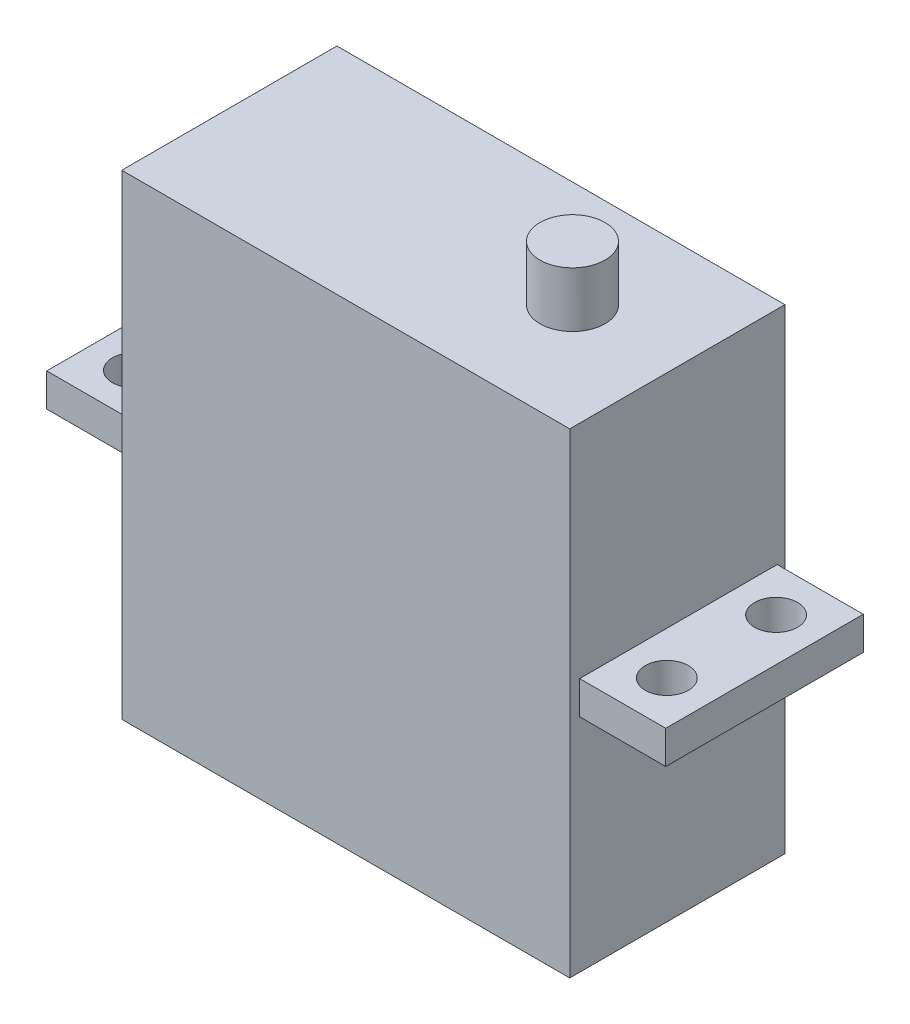
ISO-10303-21;
HEADER;
FILE_DESCRIPTION(('STEP AP214'),'2;1');
FILE_NAME('part.step','',(''),(''),'','','');
FILE_SCHEMA(('AUTOMOTIVE_DESIGN { 1 0 10303 214 1 1 1 1 }'));
ENDSEC;
DATA;
#1=APPLICATION_CONTEXT('core data for automotive mechanical design processes');
#2=APPLICATION_PROTOCOL_DEFINITION('international standard','automotive_design',2000,#1);
#3=PRODUCT_CONTEXT('',#1,'mechanical');
#4=PRODUCT('Part','Part','',(#3));
#5=PRODUCT_RELATED_PRODUCT_CATEGORY('part','',(#4));
#6=PRODUCT_DEFINITION_FORMATION('','',#4);
#7=PRODUCT_DEFINITION_CONTEXT('part definition',#1,'design');
#8=PRODUCT_DEFINITION('design','',#6,#7);
#9=PRODUCT_DEFINITION_SHAPE('','',#8);
#10=(LENGTH_UNIT() NAMED_UNIT(*) SI_UNIT(.MILLI.,.METRE.));
#11=(NAMED_UNIT(*) PLANE_ANGLE_UNIT() SI_UNIT($,.RADIAN.));
#12=(NAMED_UNIT(*) SI_UNIT($,.STERADIAN.) SOLID_ANGLE_UNIT());
#13=UNCERTAINTY_MEASURE_WITH_UNIT(LENGTH_MEASURE(1.E-05),#10,'distance_accuracy_value','');
#14=(GEOMETRIC_REPRESENTATION_CONTEXT(3) GLOBAL_UNCERTAINTY_ASSIGNED_CONTEXT((#13)) GLOBAL_UNIT_ASSIGNED_CONTEXT((#10,
#11,#12)) REPRESENTATION_CONTEXT('',''));
#15=CARTESIAN_POINT('',(0.,0.,0.));
#16=DIRECTION('',(0.,0.,1.));
#17=DIRECTION('',(1.,0.,0.));
#18=AXIS2_PLACEMENT_3D('',#15,#16,#17);
#19=CARTESIAN_POINT('',(-20.35,21.55,9.84999999999999));
#20=DIRECTION('',(1.,0.,0.));
#21=DIRECTION('',(0.,0.,-1.));
#22=AXIS2_PLACEMENT_3D('',#19,#20,#21);
#23=PLANE('',#22);
#24=DIRECTION('',(0.,0.,1.));
#25=VECTOR('',#24,1.);
#26=CARTESIAN_POINT('',(-20.35,-21.55,9.84999999999999));
#27=LINE('',#26,#25);
#28=CARTESIAN_POINT('',(-20.35,-21.55,-9.65000000000001));
#29=VERTEX_POINT('',#28);
#30=CARTESIAN_POINT('',(-20.35,-21.55,9.84999999999999));
#31=VERTEX_POINT('',#30);
#32=EDGE_CURVE('E195',#29,#31,#27,.T.);
#33=ORIENTED_EDGE('',*,*,#32,.T.);
#34=DIRECTION('',(0.,-1.,0.));
#35=VECTOR('',#34,1.);
#36=CARTESIAN_POINT('',(-20.35,21.55,9.84999999999999));
#37=LINE('',#36,#35);
#38=CARTESIAN_POINT('',(-20.35,21.55,9.84999999999999));
#39=VERTEX_POINT('',#38);
#40=EDGE_CURVE('E201',#39,#31,#37,.T.);
#41=ORIENTED_EDGE('',*,*,#40,.F.);
#42=DIRECTION('',(0.,0.,1.));
#43=VECTOR('',#42,1.);
#44=CARTESIAN_POINT('',(-20.35,21.55,9.84999999999999));
#45=LINE('',#44,#43);
#46=CARTESIAN_POINT('',(-20.35,21.55,-9.65000000000001));
#47=VERTEX_POINT('',#46);
#48=EDGE_CURVE('E199',#47,#39,#45,.T.);
#49=ORIENTED_EDGE('',*,*,#48,.F.);
#50=DIRECTION('',(0.,-1.,0.));
#51=VECTOR('',#50,1.);
#52=CARTESIAN_POINT('',(-20.35,21.55,-9.65000000000001));
#53=LINE('',#52,#51);
#54=EDGE_CURVE('E211',#47,#29,#53,.T.);
#55=ORIENTED_EDGE('',*,*,#54,.T.);
#56=EDGE_LOOP('',(#33,#41,#49,#55));
#57=FACE_BOUND('',#56,.T.);
#58=DIRECTION('',(0.,1.,0.));
#59=VECTOR('',#58,1.);
#60=CARTESIAN_POINT('',(-20.35,21.55,8.95));
#61=LINE('',#60,#59);
#62=CARTESIAN_POINT('',(-20.35,-1.5,8.95));
#63=VERTEX_POINT('',#62);
#64=CARTESIAN_POINT('',(-20.35,1.5,8.95));
#65=VERTEX_POINT('',#64);
#66=EDGE_CURVE('E11',#63,#65,#61,.T.);
#67=ORIENTED_EDGE('',*,*,#66,.F.);
#68=DIRECTION('',(0.,0.,-1.));
#69=VECTOR('',#68,1.);
#70=CARTESIAN_POINT('',(-20.35,-1.5,9.84999999999999));
#71=LINE('',#70,#69);
#72=CARTESIAN_POINT('',(-20.35,-1.5,-8.95));
#73=VERTEX_POINT('',#72);
#74=EDGE_CURVE('E226',#63,#73,#71,.T.);
#75=ORIENTED_EDGE('',*,*,#74,.T.);
#76=DIRECTION('',(0.,-1.,0.));
#77=VECTOR('',#76,1.);
#78=CARTESIAN_POINT('',(-20.35,21.55,-8.95));
#79=LINE('',#78,#77);
#80=CARTESIAN_POINT('',(-20.35,1.5,-8.95));
#81=VERTEX_POINT('',#80);
#82=EDGE_CURVE('E223',#81,#73,#79,.T.);
#83=ORIENTED_EDGE('',*,*,#82,.F.);
#84=DIRECTION('',(0.,0.,-1.));
#85=VECTOR('',#84,1.);
#86=CARTESIAN_POINT('',(-20.35,1.5,9.84999999999999));
#87=LINE('',#86,#85);
#88=EDGE_CURVE('E40',#65,#81,#87,.T.);
#89=ORIENTED_EDGE('',*,*,#88,.F.);
#90=EDGE_LOOP('',(#67,#75,#83,#89));
#91=FACE_BOUND('',#90,.T.);
#92=ADVANCED_FACE('F32',(#57,#91),#23,.F.);
#93=CARTESIAN_POINT('',(20.25,21.55,9.85));
#94=DIRECTION('',(-1.,0.,0.));
#95=DIRECTION('',(0.,0.,1.));
#96=AXIS2_PLACEMENT_3D('',#93,#94,#95);
#97=PLANE('',#96);
#98=DIRECTION('',(0.,0.,-1.));
#99=VECTOR('',#98,1.);
#100=CARTESIAN_POINT('',(20.25,-21.55,9.85));
#101=LINE('',#100,#99);
#102=CARTESIAN_POINT('',(20.25,-21.55,9.85));
#103=VERTEX_POINT('',#102);
#104=CARTESIAN_POINT('',(20.25,-21.55,-9.65));
#105=VERTEX_POINT('',#104);
#106=EDGE_CURVE('E204',#103,#105,#101,.T.);
#107=ORIENTED_EDGE('',*,*,#106,.T.);
#108=DIRECTION('',(0.,-1.,0.));
#109=VECTOR('',#108,1.);
#110=CARTESIAN_POINT('',(20.25,21.55,-9.65));
#111=LINE('',#110,#109);
#112=CARTESIAN_POINT('',(20.25,21.55,-9.65));
#113=VERTEX_POINT('',#112);
#114=EDGE_CURVE('E214',#113,#105,#111,.T.);
#115=ORIENTED_EDGE('',*,*,#114,.F.);
#116=DIRECTION('',(0.,0.,-1.));
#117=VECTOR('',#116,1.);
#118=CARTESIAN_POINT('',(20.25,21.55,9.85));
#119=LINE('',#118,#117);
#120=CARTESIAN_POINT('',(20.25,21.55,9.85));
#121=VERTEX_POINT('',#120);
#122=EDGE_CURVE('E194',#121,#113,#119,.T.);
#123=ORIENTED_EDGE('',*,*,#122,.F.);
#124=DIRECTION('',(0.,-1.,0.));
#125=VECTOR('',#124,1.);
#126=CARTESIAN_POINT('',(20.25,21.55,9.85));
#127=LINE('',#126,#125);
#128=EDGE_CURVE('E217',#121,#103,#127,.T.);
#129=ORIENTED_EDGE('',*,*,#128,.T.);
#130=EDGE_LOOP('',(#107,#115,#123,#129));
#131=FACE_BOUND('',#130,.T.);
#132=DIRECTION('',(0.,-1.,0.));
#133=VECTOR('',#132,1.);
#134=CARTESIAN_POINT('',(20.25,1.5,8.95));
#135=LINE('',#134,#133);
#136=CARTESIAN_POINT('',(20.25,1.5,8.95));
#137=VERTEX_POINT('',#136);
#138=CARTESIAN_POINT('',(20.25,-1.5,8.95));
#139=VERTEX_POINT('',#138);
#140=EDGE_CURVE('E168',#137,#139,#135,.T.);
#141=ORIENTED_EDGE('',*,*,#140,.F.);
#142=DIRECTION('',(0.,0.,1.));
#143=VECTOR('',#142,1.);
#144=CARTESIAN_POINT('',(20.25,1.5,-8.95));
#145=LINE('',#144,#143);
#146=CARTESIAN_POINT('',(20.25,1.5,-8.95));
#147=VERTEX_POINT('',#146);
#148=EDGE_CURVE('E165',#147,#137,#145,.T.);
#149=ORIENTED_EDGE('',*,*,#148,.F.);
#150=DIRECTION('',(0.,-1.,0.));
#151=VECTOR('',#150,1.);
#152=CARTESIAN_POINT('',(20.25,1.5,-8.95));
#153=LINE('',#152,#151);
#154=CARTESIAN_POINT('',(20.25,-1.5,-8.95));
#155=VERTEX_POINT('',#154);
#156=EDGE_CURVE('E179',#147,#155,#153,.T.);
#157=ORIENTED_EDGE('',*,*,#156,.T.);
#158=DIRECTION('',(0.,0.,1.));
#159=VECTOR('',#158,1.);
#160=CARTESIAN_POINT('',(20.25,-1.5,-8.95));
#161=LINE('',#160,#159);
#162=EDGE_CURVE('E160',#155,#139,#161,.T.);
#163=ORIENTED_EDGE('',*,*,#162,.T.);
#164=EDGE_LOOP('',(#141,#149,#157,#163));
#165=FACE_BOUND('',#164,.T.);
#166=ADVANCED_FACE('F238',(#131,#165),#97,.F.);
#167=CARTESIAN_POINT('',(-20.35,21.55,9.84999999999999));
#168=DIRECTION('',(0.,-1.,0.));
#169=DIRECTION('',(0.,0.,-1.));
#170=AXIS2_PLACEMENT_3D('',#167,#168,#169);
#171=PLANE('',#170);
#172=DIRECTION('',(1.,0.,0.));
#173=VECTOR('',#172,1.);
#174=CARTESIAN_POINT('',(20.25,21.55,9.85));
#175=LINE('',#174,#173);
#176=EDGE_CURVE('E191',#39,#121,#175,.T.);
#177=ORIENTED_EDGE('',*,*,#176,.T.);
#178=ORIENTED_EDGE('',*,*,#122,.T.);
#179=DIRECTION('',(-1.,0.,0.));
#180=VECTOR('',#179,1.);
#181=CARTESIAN_POINT('',(-20.35,21.55,-9.65000000000001));
#182=LINE('',#181,#180);
#183=EDGE_CURVE('E197',#113,#47,#182,.T.);
#184=ORIENTED_EDGE('',*,*,#183,.T.);
#185=ORIENTED_EDGE('',*,*,#48,.T.);
#186=EDGE_LOOP('',(#177,#178,#184,#185));
#187=FACE_BOUND('',#186,.T.);
#188=CARTESIAN_POINT('',(10.6504897084707,21.55,0.00303524958051263));
#189=DIRECTION('',(0.,-1.,0.));
#190=DIRECTION('',(0.,0.,-1.));
#191=AXIS2_PLACEMENT_3D('',#188,#189,#190);
#192=CIRCLE('',#191,2.95);
#193=CARTESIAN_POINT('',(10.6504897084707,21.55,-2.94696475041949));
#194=VERTEX_POINT('',#193);
#195=EDGE_CURVE('E220',#194,#194,#192,.F.);
#196=ORIENTED_EDGE('',*,*,#195,.F.);
#197=EDGE_LOOP('',(#196));
#198=FACE_BOUND('',#197,.T.);
#199=ADVANCED_FACE('F244',(#187,#198),#171,.F.);
#200=CARTESIAN_POINT('',(20.25,21.55,9.85));
#201=DIRECTION('',(0.,0.,-1.));
#202=DIRECTION('',(-1.,0.,0.));
#203=AXIS2_PLACEMENT_3D('',#200,#201,#202);
#204=PLANE('',#203);
#205=DIRECTION('',(1.,0.,0.));
#206=VECTOR('',#205,1.);
#207=CARTESIAN_POINT('',(20.25,-21.55,9.85));
#208=LINE('',#207,#206);
#209=EDGE_CURVE('E190',#31,#103,#208,.T.);
#210=ORIENTED_EDGE('',*,*,#209,.T.);
#211=ORIENTED_EDGE('',*,*,#128,.F.);
#212=ORIENTED_EDGE('',*,*,#176,.F.);
#213=ORIENTED_EDGE('',*,*,#40,.T.);
#214=EDGE_LOOP('',(#210,#211,#212,#213));
#215=FACE_BOUND('',#214,.T.);
#216=ADVANCED_FACE('F34',(#215),#204,.F.);
#217=CARTESIAN_POINT('',(-20.35,21.55,-9.65000000000001));
#218=DIRECTION('',(0.,0.,1.));
#219=DIRECTION('',(1.,0.,0.));
#220=AXIS2_PLACEMENT_3D('',#217,#218,#219);
#221=PLANE('',#220);
#222=DIRECTION('',(-1.,0.,0.));
#223=VECTOR('',#222,1.);
#224=CARTESIAN_POINT('',(-20.35,-21.55,-9.65000000000001));
#225=LINE('',#224,#223);
#226=EDGE_CURVE('E206',#105,#29,#225,.T.);
#227=ORIENTED_EDGE('',*,*,#226,.T.);
#228=ORIENTED_EDGE('',*,*,#54,.F.);
#229=ORIENTED_EDGE('',*,*,#183,.F.);
#230=ORIENTED_EDGE('',*,*,#114,.T.);
#231=EDGE_LOOP('',(#227,#228,#229,#230));
#232=FACE_BOUND('',#231,.T.);
#233=ADVANCED_FACE('F250',(#232),#221,.F.);
#234=CARTESIAN_POINT('',(-20.35,-21.55,9.84999999999999));
#235=DIRECTION('',(0.,-1.,0.));
#236=DIRECTION('',(0.,0.,-1.));
#237=AXIS2_PLACEMENT_3D('',#234,#235,#236);
#238=PLANE('',#237);
#239=ORIENTED_EDGE('',*,*,#209,.F.);
#240=ORIENTED_EDGE('',*,*,#32,.F.);
#241=ORIENTED_EDGE('',*,*,#226,.F.);
#242=ORIENTED_EDGE('',*,*,#106,.F.);
#243=EDGE_LOOP('',(#239,#240,#241,#242));
#244=FACE_BOUND('',#243,.T.);
#245=ADVANCED_FACE('F248',(#244),#238,.T.);
#246=CARTESIAN_POINT('',(10.6504897084707,26.55,0.00303524958051263));
#247=DIRECTION('',(0.,-1.,0.));
#248=DIRECTION('',(0.,0.,-1.));
#249=AXIS2_PLACEMENT_3D('',#246,#247,#248);
#250=CYLINDRICAL_SURFACE('',#249,2.95);
#251=CARTESIAN_POINT('',(10.6504897084707,26.55,0.00303524958051263));
#252=DIRECTION('',(0.,1.,0.));
#253=DIRECTION('',(0.,0.,1.));
#254=AXIS2_PLACEMENT_3D('',#251,#252,#253);
#255=CIRCLE('',#254,2.95);
#256=CARTESIAN_POINT('',(10.6504897084707,26.55,2.95303524958051));
#257=VERTEX_POINT('',#256);
#258=EDGE_CURVE('E187',#257,#257,#255,.T.);
#259=ORIENTED_EDGE('',*,*,#258,.F.);
#260=EDGE_LOOP('',(#259));
#261=FACE_BOUND('',#260,.T.);
#262=ORIENTED_EDGE('',*,*,#195,.T.);
#263=EDGE_LOOP('',(#262));
#264=FACE_BOUND('',#263,.T.);
#265=ADVANCED_FACE('F257',(#261,#264),#250,.T.);
#266=CARTESIAN_POINT('',(10.6504897084707,26.55,0.00303524958051263));
#267=DIRECTION('',(0.,1.,0.));
#268=DIRECTION('',(0.,0.,1.));
#269=AXIS2_PLACEMENT_3D('',#266,#267,#268);
#270=PLANE('',#269);
#271=ORIENTED_EDGE('',*,*,#258,.T.);
#272=EDGE_LOOP('',(#271));
#273=FACE_BOUND('',#272,.T.);
#274=ADVANCED_FACE('F315',(#273),#270,.T.);
#275=CARTESIAN_POINT('',(20.25,1.5,8.94999999999999));
#276=DIRECTION('',(0.,1.,0.));
#277=DIRECTION('',(0.,0.,1.));
#278=AXIS2_PLACEMENT_3D('',#275,#276,#277);
#279=PLANE('',#278);
#280=CARTESIAN_POINT('',(24.15,1.5,4.95));
#281=DIRECTION('',(0.,1.,0.));
#282=DIRECTION('',(0.,0.,-1.));
#283=AXIS2_PLACEMENT_3D('',#280,#281,#282);
#284=CIRCLE('',#283,1.95);
#285=CARTESIAN_POINT('',(24.15,1.5,3.));
#286=VERTEX_POINT('',#285);
#287=EDGE_CURVE('E150',#286,#286,#284,.T.);
#288=ORIENTED_EDGE('',*,*,#287,.F.);
#289=EDGE_LOOP('',(#288));
#290=FACE_BOUND('',#289,.T.);
#291=DIRECTION('',(1.,0.,0.));
#292=VECTOR('',#291,1.);
#293=CARTESIAN_POINT('',(28.05,1.5,8.94999999999999));
#294=LINE('',#293,#292);
#295=CARTESIAN_POINT('',(28.05,1.5,8.94999999999999));
#296=VERTEX_POINT('',#295);
#297=EDGE_CURVE('E156',#137,#296,#294,.T.);
#298=ORIENTED_EDGE('',*,*,#297,.T.);
#299=DIRECTION('',(0.,0.,-1.));
#300=VECTOR('',#299,1.);
#301=CARTESIAN_POINT('',(28.05,1.5,8.94999999999999));
#302=LINE('',#301,#300);
#303=CARTESIAN_POINT('',(28.05,1.5,-8.95));
#304=VERTEX_POINT('',#303);
#305=EDGE_CURVE('E159',#296,#304,#302,.T.);
#306=ORIENTED_EDGE('',*,*,#305,.T.);
#307=DIRECTION('',(-1.,0.,0.));
#308=VECTOR('',#307,1.);
#309=CARTESIAN_POINT('',(28.05,1.5,-8.95));
#310=LINE('',#309,#308);
#311=EDGE_CURVE('E162',#304,#147,#310,.T.);
#312=ORIENTED_EDGE('',*,*,#311,.T.);
#313=ORIENTED_EDGE('',*,*,#148,.T.);
#314=EDGE_LOOP('',(#298,#306,#312,#313));
#315=FACE_BOUND('',#314,.T.);
#316=CARTESIAN_POINT('',(24.15,1.5,-4.95));
#317=DIRECTION('',(0.,1.,0.));
#318=DIRECTION('',(0.,0.,1.));
#319=AXIS2_PLACEMENT_3D('',#316,#317,#318);
#320=CIRCLE('',#319,1.95);
#321=CARTESIAN_POINT('',(24.15,1.5,-3.));
#322=VERTEX_POINT('',#321);
#323=EDGE_CURVE('E142',#322,#322,#320,.T.);
#324=ORIENTED_EDGE('',*,*,#323,.F.);
#325=EDGE_LOOP('',(#324));
#326=FACE_BOUND('',#325,.T.);
#327=ADVANCED_FACE('F278',(#290,#315,#326),#279,.T.);
#328=CARTESIAN_POINT('',(20.25,-1.5,8.94999999999999));
#329=DIRECTION('',(0.,1.,0.));
#330=DIRECTION('',(0.,0.,1.));
#331=AXIS2_PLACEMENT_3D('',#328,#329,#330);
#332=PLANE('',#331);
#333=CARTESIAN_POINT('',(24.15,-1.5,4.95));
#334=DIRECTION('',(0.,1.,0.));
#335=DIRECTION('',(0.,0.,-1.));
#336=AXIS2_PLACEMENT_3D('',#333,#334,#335);
#337=CIRCLE('',#336,1.95);
#338=CARTESIAN_POINT('',(24.15,-1.5,3.));
#339=VERTEX_POINT('',#338);
#340=EDGE_CURVE('E148',#339,#339,#337,.T.);
#341=ORIENTED_EDGE('',*,*,#340,.T.);
#342=EDGE_LOOP('',(#341));
#343=FACE_BOUND('',#342,.T.);
#344=DIRECTION('',(1.,0.,0.));
#345=VECTOR('',#344,1.);
#346=CARTESIAN_POINT('',(28.05,-1.5,8.94999999999999));
#347=LINE('',#346,#345);
#348=CARTESIAN_POINT('',(28.05,-1.5,8.94999999999999));
#349=VERTEX_POINT('',#348);
#350=EDGE_CURVE('E153',#139,#349,#347,.T.);
#351=ORIENTED_EDGE('',*,*,#350,.F.);
#352=ORIENTED_EDGE('',*,*,#162,.F.);
#353=DIRECTION('',(-1.,0.,0.));
#354=VECTOR('',#353,1.);
#355=CARTESIAN_POINT('',(28.05,-1.5,-8.95));
#356=LINE('',#355,#354);
#357=CARTESIAN_POINT('',(28.05,-1.5,-8.95));
#358=VERTEX_POINT('',#357);
#359=EDGE_CURVE('E173',#358,#155,#356,.T.);
#360=ORIENTED_EDGE('',*,*,#359,.F.);
#361=DIRECTION('',(0.,0.,-1.));
#362=VECTOR('',#361,1.);
#363=CARTESIAN_POINT('',(28.05,-1.5,8.94999999999999));
#364=LINE('',#363,#362);
#365=EDGE_CURVE('E171',#349,#358,#364,.T.);
#366=ORIENTED_EDGE('',*,*,#365,.F.);
#367=EDGE_LOOP('',(#351,#352,#360,#366));
#368=FACE_BOUND('',#367,.T.);
#369=CARTESIAN_POINT('',(24.15,-1.5,-4.95));
#370=DIRECTION('',(0.,1.,0.));
#371=DIRECTION('',(0.,0.,1.));
#372=AXIS2_PLACEMENT_3D('',#369,#370,#371);
#373=CIRCLE('',#372,1.95);
#374=CARTESIAN_POINT('',(24.15,-1.5,-3.));
#375=VERTEX_POINT('',#374);
#376=EDGE_CURVE('E138',#375,#375,#373,.T.);
#377=ORIENTED_EDGE('',*,*,#376,.T.);
#378=EDGE_LOOP('',(#377));
#379=FACE_BOUND('',#378,.T.);
#380=ADVANCED_FACE('F291',(#343,#368,#379),#332,.F.);
#381=CARTESIAN_POINT('',(28.05,1.5,8.94999999999999));
#382=DIRECTION('',(0.,0.,-1.));
#383=DIRECTION('',(-1.,0.,0.));
#384=AXIS2_PLACEMENT_3D('',#381,#382,#383);
#385=PLANE('',#384);
#386=ORIENTED_EDGE('',*,*,#350,.T.);
#387=DIRECTION('',(0.,-1.,0.));
#388=VECTOR('',#387,1.);
#389=CARTESIAN_POINT('',(28.05,1.5,8.94999999999999));
#390=LINE('',#389,#388);
#391=EDGE_CURVE('E184',#296,#349,#390,.T.);
#392=ORIENTED_EDGE('',*,*,#391,.F.);
#393=ORIENTED_EDGE('',*,*,#297,.F.);
#394=ORIENTED_EDGE('',*,*,#140,.T.);
#395=EDGE_LOOP('',(#386,#392,#393,#394));
#396=FACE_BOUND('',#395,.T.);
#397=ADVANCED_FACE('F283',(#396),#385,.F.);
#398=CARTESIAN_POINT('',(28.05,1.5,8.94999999999999));
#399=DIRECTION('',(-1.,0.,0.));
#400=DIRECTION('',(0.,0.,1.));
#401=AXIS2_PLACEMENT_3D('',#398,#399,#400);
#402=PLANE('',#401);
#403=ORIENTED_EDGE('',*,*,#365,.T.);
#404=DIRECTION('',(0.,-1.,0.));
#405=VECTOR('',#404,1.);
#406=CARTESIAN_POINT('',(28.05,1.5,-8.95));
#407=LINE('',#406,#405);
#408=EDGE_CURVE('E181',#304,#358,#407,.T.);
#409=ORIENTED_EDGE('',*,*,#408,.F.);
#410=ORIENTED_EDGE('',*,*,#305,.F.);
#411=ORIENTED_EDGE('',*,*,#391,.T.);
#412=EDGE_LOOP('',(#403,#409,#410,#411));
#413=FACE_BOUND('',#412,.T.);
#414=ADVANCED_FACE('F285',(#413),#402,.F.);
#415=CARTESIAN_POINT('',(28.05,1.5,-8.95));
#416=DIRECTION('',(0.,0.,1.));
#417=DIRECTION('',(1.,0.,0.));
#418=AXIS2_PLACEMENT_3D('',#415,#416,#417);
#419=PLANE('',#418);
#420=ORIENTED_EDGE('',*,*,#359,.T.);
#421=ORIENTED_EDGE('',*,*,#156,.F.);
#422=ORIENTED_EDGE('',*,*,#311,.F.);
#423=ORIENTED_EDGE('',*,*,#408,.T.);
#424=EDGE_LOOP('',(#420,#421,#422,#423));
#425=FACE_BOUND('',#424,.T.);
#426=ADVANCED_FACE('F289',(#425),#419,.F.);
#427=CARTESIAN_POINT('',(24.15,1.5,4.95));
#428=DIRECTION('',(0.,-1.,0.));
#429=DIRECTION('',(0.,0.,-1.));
#430=AXIS2_PLACEMENT_3D('',#427,#428,#429);
#431=CYLINDRICAL_SURFACE('',#430,1.95);
#432=ORIENTED_EDGE('',*,*,#287,.T.);
#433=EDGE_LOOP('',(#432));
#434=FACE_BOUND('',#433,.T.);
#435=ORIENTED_EDGE('',*,*,#340,.F.);
#436=EDGE_LOOP('',(#435));
#437=FACE_BOUND('',#436,.T.);
#438=ADVANCED_FACE('F300',(#434,#437),#431,.F.);
#439=CARTESIAN_POINT('',(24.15,1.5,-4.95));
#440=DIRECTION('',(0.,-1.,0.));
#441=DIRECTION('',(0.,0.,-1.));
#442=AXIS2_PLACEMENT_3D('',#439,#440,#441);
#443=CYLINDRICAL_SURFACE('',#442,1.95);
#444=ORIENTED_EDGE('',*,*,#323,.T.);
#445=EDGE_LOOP('',(#444));
#446=FACE_BOUND('',#445,.T.);
#447=ORIENTED_EDGE('',*,*,#376,.F.);
#448=EDGE_LOOP('',(#447));
#449=FACE_BOUND('',#448,.T.);
#450=ADVANCED_FACE('F298',(#446,#449),#443,.F.);
#451=CARTESIAN_POINT('',(-28.05,1.5,-8.95));
#452=DIRECTION('',(0.,-1.,0.));
#453=DIRECTION('',(0.,0.,-1.));
#454=AXIS2_PLACEMENT_3D('',#451,#452,#453);
#455=PLANE('',#454);
#456=CARTESIAN_POINT('',(-24.15,1.5,4.95));
#457=DIRECTION('',(0.,1.,0.));
#458=DIRECTION('',(0.,0.,1.));
#459=AXIS2_PLACEMENT_3D('',#456,#457,#458);
#460=CIRCLE('',#459,1.95);
#461=CARTESIAN_POINT('',(-24.15,1.5,6.9));
#462=VERTEX_POINT('',#461);
#463=EDGE_CURVE('E450',#462,#462,#460,.T.);
#464=ORIENTED_EDGE('',*,*,#463,.F.);
#465=EDGE_LOOP('',(#464));
#466=FACE_BOUND('',#465,.T.);
#467=CARTESIAN_POINT('',(-24.15,1.5,-4.95));
#468=DIRECTION('',(0.,1.,0.));
#469=DIRECTION('',(0.,0.,-1.));
#470=AXIS2_PLACEMENT_3D('',#467,#468,#469);
#471=CIRCLE('',#470,1.95);
#472=CARTESIAN_POINT('',(-24.15,1.5,-6.9));
#473=VERTEX_POINT('',#472);
#474=EDGE_CURVE('E234',#473,#473,#471,.T.);
#475=ORIENTED_EDGE('',*,*,#474,.F.);
#476=EDGE_LOOP('',(#475));
#477=FACE_BOUND('',#476,.T.);
#478=DIRECTION('',(1.,0.,0.));
#479=VECTOR('',#478,1.);
#480=CARTESIAN_POINT('',(-28.05,1.5,8.94999999999999));
#481=LINE('',#480,#479);
#482=CARTESIAN_POINT('',(-28.05,1.5,8.94999999999999));
#483=VERTEX_POINT('',#482);
#484=EDGE_CURVE('E116',#483,#65,#481,.T.);
#485=ORIENTED_EDGE('',*,*,#484,.T.);
#486=ORIENTED_EDGE('',*,*,#88,.T.);
#487=DIRECTION('',(-1.,0.,0.));
#488=VECTOR('',#487,1.);
#489=CARTESIAN_POINT('',(-28.05,1.5,-8.95));
#490=LINE('',#489,#488);
#491=CARTESIAN_POINT('',(-28.05,1.5,-8.95));
#492=VERTEX_POINT('',#491);
#493=EDGE_CURVE('E124',#81,#492,#490,.T.);
#494=ORIENTED_EDGE('',*,*,#493,.T.);
#495=DIRECTION('',(0.,0.,1.));
#496=VECTOR('',#495,1.);
#497=CARTESIAN_POINT('',(-28.05,1.5,8.94999999999999));
#498=LINE('',#497,#496);
#499=EDGE_CURVE('E125',#492,#483,#498,.T.);
#500=ORIENTED_EDGE('',*,*,#499,.T.);
#501=EDGE_LOOP('',(#485,#486,#494,#500));
#502=FACE_BOUND('',#501,.T.);
#503=ADVANCED_FACE('F128',(#466,#477,#502),#455,.F.);
#504=CARTESIAN_POINT('',(-28.05,-1.5,-8.95));
#505=DIRECTION('',(0.,-1.,0.));
#506=DIRECTION('',(0.,0.,-1.));
#507=AXIS2_PLACEMENT_3D('',#504,#505,#506);
#508=PLANE('',#507);
#509=CARTESIAN_POINT('',(-24.15,-1.5,4.95));
#510=DIRECTION('',(0.,1.,0.));
#511=DIRECTION('',(0.,0.,1.));
#512=AXIS2_PLACEMENT_3D('',#509,#510,#511);
#513=CIRCLE('',#512,1.95);
#514=CARTESIAN_POINT('',(-24.15,-1.5,6.9));
#515=VERTEX_POINT('',#514);
#516=EDGE_CURVE('E453',#515,#515,#513,.T.);
#517=ORIENTED_EDGE('',*,*,#516,.T.);
#518=EDGE_LOOP('',(#517));
#519=FACE_BOUND('',#518,.T.);
#520=CARTESIAN_POINT('',(-24.15,-1.5,-4.95));
#521=DIRECTION('',(0.,1.,0.));
#522=DIRECTION('',(0.,0.,-1.));
#523=AXIS2_PLACEMENT_3D('',#520,#521,#522);
#524=CIRCLE('',#523,1.95);
#525=CARTESIAN_POINT('',(-24.15,-1.5,-6.9));
#526=VERTEX_POINT('',#525);
#527=EDGE_CURVE('E455',#526,#526,#524,.T.);
#528=ORIENTED_EDGE('',*,*,#527,.T.);
#529=EDGE_LOOP('',(#528));
#530=FACE_BOUND('',#529,.T.);
#531=ORIENTED_EDGE('',*,*,#74,.F.);
#532=DIRECTION('',(1.,0.,0.));
#533=VECTOR('',#532,1.);
#534=CARTESIAN_POINT('',(-28.05,-1.5,8.94999999999999));
#535=LINE('',#534,#533);
#536=CARTESIAN_POINT('',(-28.05,-1.5,8.94999999999999));
#537=VERTEX_POINT('',#536);
#538=EDGE_CURVE('E233',#537,#63,#535,.T.);
#539=ORIENTED_EDGE('',*,*,#538,.F.);
#540=DIRECTION('',(0.,0.,1.));
#541=VECTOR('',#540,1.);
#542=CARTESIAN_POINT('',(-28.05,-1.5,8.94999999999999));
#543=LINE('',#542,#541);
#544=CARTESIAN_POINT('',(-28.05,-1.5,-8.95));
#545=VERTEX_POINT('',#544);
#546=EDGE_CURVE('E137',#545,#537,#543,.T.);
#547=ORIENTED_EDGE('',*,*,#546,.F.);
#548=DIRECTION('',(-1.,0.,0.));
#549=VECTOR('',#548,1.);
#550=CARTESIAN_POINT('',(-28.05,-1.5,-8.95));
#551=LINE('',#550,#549);
#552=EDGE_CURVE('E133',#73,#545,#551,.T.);
#553=ORIENTED_EDGE('',*,*,#552,.F.);
#554=EDGE_LOOP('',(#531,#539,#547,#553));
#555=FACE_BOUND('',#554,.T.);
#556=ADVANCED_FACE('F236',(#519,#530,#555),#508,.T.);
#557=CARTESIAN_POINT('',(-28.05,1.5,8.94999999999999));
#558=DIRECTION('',(0.,0.,-1.));
#559=DIRECTION('',(-1.,0.,0.));
#560=AXIS2_PLACEMENT_3D('',#557,#558,#559);
#561=PLANE('',#560);
#562=ORIENTED_EDGE('',*,*,#538,.T.);
#563=ORIENTED_EDGE('',*,*,#66,.T.);
#564=ORIENTED_EDGE('',*,*,#484,.F.);
#565=DIRECTION('',(0.,-1.,0.));
#566=VECTOR('',#565,1.);
#567=CARTESIAN_POINT('',(-28.05,1.5,8.94999999999999));
#568=LINE('',#567,#566);
#569=EDGE_CURVE('E121',#483,#537,#568,.T.);
#570=ORIENTED_EDGE('',*,*,#569,.T.);
#571=EDGE_LOOP('',(#562,#563,#564,#570));
#572=FACE_BOUND('',#571,.T.);
#573=ADVANCED_FACE('F119',(#572),#561,.F.);
#574=CARTESIAN_POINT('',(-28.05,1.5,-8.95));
#575=DIRECTION('',(0.,0.,1.));
#576=DIRECTION('',(1.,0.,0.));
#577=AXIS2_PLACEMENT_3D('',#574,#575,#576);
#578=PLANE('',#577);
#579=ORIENTED_EDGE('',*,*,#493,.F.);
#580=ORIENTED_EDGE('',*,*,#82,.T.);
#581=ORIENTED_EDGE('',*,*,#552,.T.);
#582=DIRECTION('',(0.,-1.,0.));
#583=VECTOR('',#582,1.);
#584=CARTESIAN_POINT('',(-28.05,1.5,-8.95));
#585=LINE('',#584,#583);
#586=EDGE_CURVE('E139',#492,#545,#585,.T.);
#587=ORIENTED_EDGE('',*,*,#586,.F.);
#588=EDGE_LOOP('',(#579,#580,#581,#587));
#589=FACE_BOUND('',#588,.T.);
#590=ADVANCED_FACE('F228',(#589),#578,.F.);
#591=CARTESIAN_POINT('',(-28.05,1.5,8.94999999999999));
#592=DIRECTION('',(1.,0.,0.));
#593=DIRECTION('',(0.,0.,-1.));
#594=AXIS2_PLACEMENT_3D('',#591,#592,#593);
#595=PLANE('',#594);
#596=ORIENTED_EDGE('',*,*,#546,.T.);
#597=ORIENTED_EDGE('',*,*,#569,.F.);
#598=ORIENTED_EDGE('',*,*,#499,.F.);
#599=ORIENTED_EDGE('',*,*,#586,.T.);
#600=EDGE_LOOP('',(#596,#597,#598,#599));
#601=FACE_BOUND('',#600,.T.);
#602=ADVANCED_FACE('F135',(#601),#595,.F.);
#603=CARTESIAN_POINT('',(-24.15,1.5,-4.95));
#604=DIRECTION('',(0.,-1.,0.));
#605=DIRECTION('',(0.,0.,-1.));
#606=AXIS2_PLACEMENT_3D('',#603,#604,#605);
#607=CYLINDRICAL_SURFACE('',#606,1.95);
#608=ORIENTED_EDGE('',*,*,#474,.T.);
#609=EDGE_LOOP('',(#608));
#610=FACE_BOUND('',#609,.T.);
#611=ORIENTED_EDGE('',*,*,#527,.F.);
#612=EDGE_LOOP('',(#611));
#613=FACE_BOUND('',#612,.T.);
#614=ADVANCED_FACE('F425',(#610,#613),#607,.F.);
#615=CARTESIAN_POINT('',(-24.15,1.5,4.95));
#616=DIRECTION('',(0.,-1.,0.));
#617=DIRECTION('',(0.,0.,-1.));
#618=AXIS2_PLACEMENT_3D('',#615,#616,#617);
#619=CYLINDRICAL_SURFACE('',#618,1.95);
#620=ORIENTED_EDGE('',*,*,#463,.T.);
#621=EDGE_LOOP('',(#620));
#622=FACE_BOUND('',#621,.T.);
#623=ORIENTED_EDGE('',*,*,#516,.F.);
#624=EDGE_LOOP('',(#623));
#625=FACE_BOUND('',#624,.T.);
#626=ADVANCED_FACE('F433',(#622,#625),#619,.F.);
#627=CLOSED_SHELL('',(#92,#166,#199,#216,#233,#245,#265,#274,#327,#380,#397,#414,#426,#438,#450,
#503,#556,#573,#590,#602,#614,#626));
#628=MANIFOLD_SOLID_BREP('B2',#627);
#629=ADVANCED_BREP_SHAPE_REPRESENTATION('',(#18,#628),#14);
#630=SHAPE_DEFINITION_REPRESENTATION(#9,#629);
ENDSEC;
END-ISO-10303-21;
